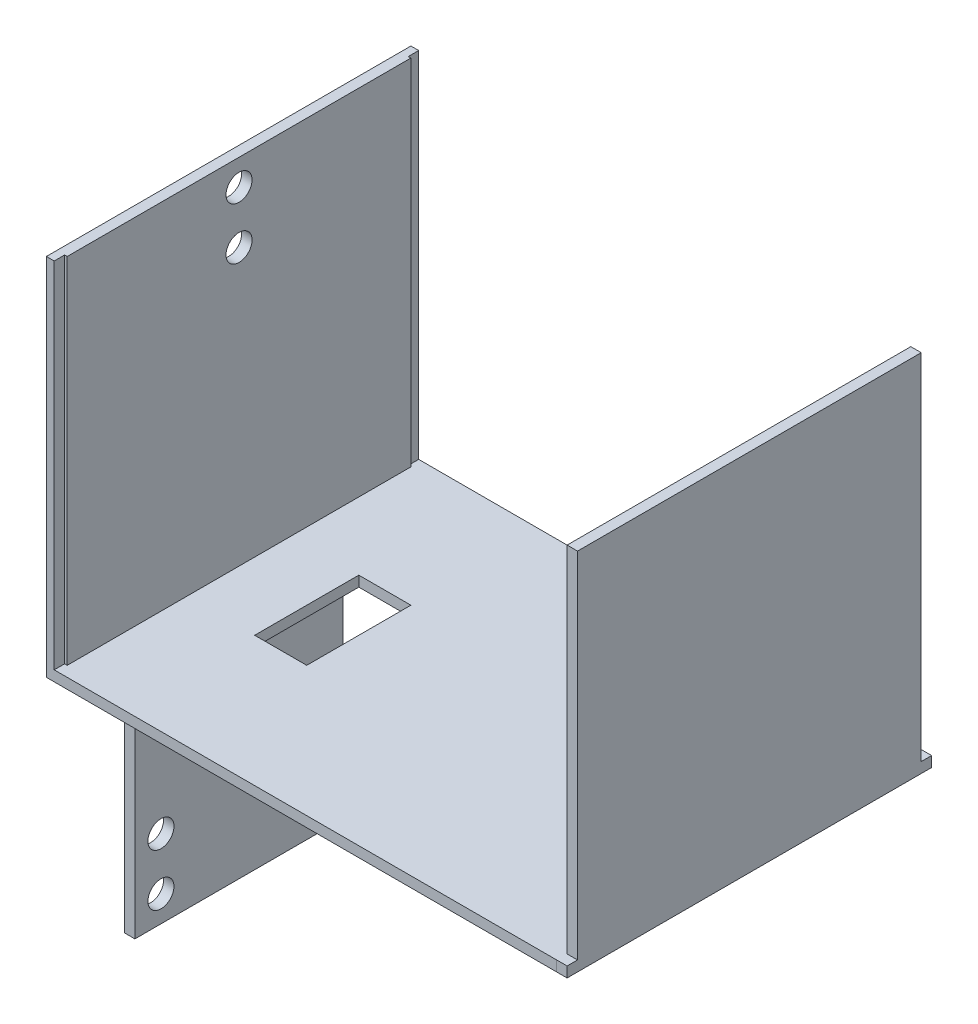
ISO-10303-21;
HEADER;
FILE_DESCRIPTION(('STEP AP214'),'2;1');
FILE_NAME('part.step','',(''),(''),'','','');
FILE_SCHEMA(('AUTOMOTIVE_DESIGN { 1 0 10303 214 1 1 1 1 }'));
ENDSEC;
DATA;
#1=APPLICATION_CONTEXT('core data for automotive mechanical design processes');
#2=APPLICATION_PROTOCOL_DEFINITION('international standard','automotive_design',2000,#1);
#3=PRODUCT_CONTEXT('',#1,'mechanical');
#4=PRODUCT('Part','Part','',(#3));
#5=PRODUCT_RELATED_PRODUCT_CATEGORY('part','',(#4));
#6=PRODUCT_DEFINITION_FORMATION('','',#4);
#7=PRODUCT_DEFINITION_CONTEXT('part definition',#1,'design');
#8=PRODUCT_DEFINITION('design','',#6,#7);
#9=PRODUCT_DEFINITION_SHAPE('','',#8);
#10=(LENGTH_UNIT() NAMED_UNIT(*) SI_UNIT(.MILLI.,.METRE.));
#11=(NAMED_UNIT(*) PLANE_ANGLE_UNIT() SI_UNIT($,.RADIAN.));
#12=(NAMED_UNIT(*) SI_UNIT($,.STERADIAN.) SOLID_ANGLE_UNIT());
#13=UNCERTAINTY_MEASURE_WITH_UNIT(LENGTH_MEASURE(1.E-05),#10,'distance_accuracy_value','');
#14=(GEOMETRIC_REPRESENTATION_CONTEXT(3) GLOBAL_UNCERTAINTY_ASSIGNED_CONTEXT((#13)) GLOBAL_UNIT_ASSIGNED_CONTEXT((#10,
#11,#12)) REPRESENTATION_CONTEXT('',''));
#15=CARTESIAN_POINT('',(0.,0.,0.));
#16=DIRECTION('',(0.,0.,1.));
#17=DIRECTION('',(1.,0.,0.));
#18=AXIS2_PLACEMENT_3D('',#15,#16,#17);
#19=CARTESIAN_POINT('',(0.,-10.8607855382087,70.));
#20=DIRECTION('',(0.,1.,0.));
#21=DIRECTION('',(0.,0.,1.));
#22=AXIS2_PLACEMENT_3D('',#19,#20,#21);
#23=PLANE('',#22);
#24=DIRECTION('',(-1.,0.,0.));
#25=VECTOR('',#24,1.);
#26=CARTESIAN_POINT('',(-23.1056124858747,-10.8607855382087,45.));
#27=LINE('',#26,#25);
#28=CARTESIAN_POINT('',(-23.1056124858747,-10.8607855382087,45.));
#29=VERTEX_POINT('',#28);
#30=CARTESIAN_POINT('',(-33.1056124858747,-10.8607855382087,45.));
#31=VERTEX_POINT('',#30);
#32=EDGE_CURVE('E350',#29,#31,#27,.T.);
#33=ORIENTED_EDGE('',*,*,#32,.F.);
#34=DIRECTION('',(0.,0.,1.));
#35=VECTOR('',#34,1.);
#36=CARTESIAN_POINT('',(-23.1056124858747,-10.8607855382087,25.));
#37=LINE('',#36,#35);
#38=CARTESIAN_POINT('',(-23.1056124858747,-10.8607855382087,25.));
#39=VERTEX_POINT('',#38);
#40=EDGE_CURVE('E353',#39,#29,#37,.T.);
#41=ORIENTED_EDGE('',*,*,#40,.F.);
#42=DIRECTION('',(1.,0.,0.));
#43=VECTOR('',#42,1.);
#44=CARTESIAN_POINT('',(-23.1056124858747,-10.8607855382087,25.));
#45=LINE('',#44,#43);
#46=CARTESIAN_POINT('',(-33.1056124858747,-10.8607855382087,25.));
#47=VERTEX_POINT('',#46);
#48=EDGE_CURVE('E340',#47,#39,#45,.T.);
#49=ORIENTED_EDGE('',*,*,#48,.F.);
#50=DIRECTION('',(0.,0.,-1.));
#51=VECTOR('',#50,1.);
#52=CARTESIAN_POINT('',(-33.1056124858747,-10.8607855382087,25.));
#53=LINE('',#52,#51);
#54=EDGE_CURVE('E347',#31,#47,#53,.T.);
#55=ORIENTED_EDGE('',*,*,#54,.F.);
#56=EDGE_LOOP('',(#33,#41,#49,#55));
#57=FACE_BOUND('',#56,.T.);
#58=DIRECTION('',(0.,0.,-1.));
#59=VECTOR('',#58,1.);
#60=CARTESIAN_POINT('',(49.8943875141253,-10.8607855382087,70.));
#61=LINE('',#60,#59);
#62=CARTESIAN_POINT('',(49.8943875141253,-10.8607855382087,70.));
#63=VERTEX_POINT('',#62);
#64=CARTESIAN_POINT('',(49.8943875141253,-10.8607855382087,0.));
#65=VERTEX_POINT('',#64);
#66=EDGE_CURVE('E11',#63,#65,#61,.T.);
#67=ORIENTED_EDGE('',*,*,#66,.F.);
#68=DIRECTION('',(1.,0.,0.));
#69=VECTOR('',#68,1.);
#70=CARTESIAN_POINT('',(0.,-10.8607855382087,70.));
#71=LINE('',#70,#69);
#72=CARTESIAN_POINT('',(-48.1056124858747,-10.8607855382087,70.));
#73=VERTEX_POINT('',#72);
#74=EDGE_CURVE('E246',#73,#63,#71,.T.);
#75=ORIENTED_EDGE('',*,*,#74,.F.);
#76=DIRECTION('',(0.,0.,-1.));
#77=VECTOR('',#76,1.);
#78=CARTESIAN_POINT('',(-48.1056124858747,-10.8607855382087,70.));
#79=LINE('',#78,#77);
#80=CARTESIAN_POINT('',(-48.1056124858747,-10.8607855382087,55.));
#81=VERTEX_POINT('',#80);
#82=EDGE_CURVE('E247',#73,#81,#79,.T.);
#83=ORIENTED_EDGE('',*,*,#82,.T.);
#84=DIRECTION('',(1.,0.,0.));
#85=VECTOR('',#84,1.);
#86=CARTESIAN_POINT('',(-48.1056124858747,-10.8607855382087,55.));
#87=LINE('',#86,#85);
#88=CARTESIAN_POINT('',(-46.1056124858747,-10.8607855382087,55.));
#89=VERTEX_POINT('',#88);
#90=EDGE_CURVE('E368',#81,#89,#87,.T.);
#91=ORIENTED_EDGE('',*,*,#90,.T.);
#92=DIRECTION('',(0.,0.,1.));
#93=VECTOR('',#92,1.);
#94=CARTESIAN_POINT('',(-46.1056124858747,-10.8607855382087,15.));
#95=LINE('',#94,#93);
#96=CARTESIAN_POINT('',(-46.1056124858747,-10.8607855382087,15.));
#97=VERTEX_POINT('',#96);
#98=EDGE_CURVE('E371',#97,#89,#95,.T.);
#99=ORIENTED_EDGE('',*,*,#98,.F.);
#100=DIRECTION('',(1.,0.,0.));
#101=VECTOR('',#100,1.);
#102=CARTESIAN_POINT('',(-48.1056124858747,-10.8607855382087,15.));
#103=LINE('',#102,#101);
#104=CARTESIAN_POINT('',(-48.1056124858747,-10.8607855382087,15.));
#105=VERTEX_POINT('',#104);
#106=EDGE_CURVE('E277',#105,#97,#103,.T.);
#107=ORIENTED_EDGE('',*,*,#106,.F.);
#108=CARTESIAN_POINT('',(-48.1056124858747,-10.8607855382087,0.));
#109=VERTEX_POINT('',#108);
#110=EDGE_CURVE('E245',#105,#109,#79,.T.);
#111=ORIENTED_EDGE('',*,*,#110,.T.);
#112=DIRECTION('',(1.,0.,0.));
#113=VECTOR('',#112,1.);
#114=CARTESIAN_POINT('',(0.,-10.8607855382087,0.));
#115=LINE('',#114,#113);
#116=EDGE_CURVE('E239',#109,#65,#115,.T.);
#117=ORIENTED_EDGE('',*,*,#116,.T.);
#118=EDGE_LOOP('',(#67,#75,#83,#91,#99,#107,#111,#117));
#119=FACE_BOUND('',#118,.T.);
#120=ADVANCED_FACE('F43',(#57,#119),#23,.F.);
#121=CARTESIAN_POINT('',(0.,0.,70.));
#122=DIRECTION('',(0.,0.,1.));
#123=DIRECTION('',(1.,0.,0.));
#124=AXIS2_PLACEMENT_3D('',#121,#122,#123);
#125=PLANE('',#124);
#126=DIRECTION('',(1.,0.,0.));
#127=VECTOR('',#126,1.);
#128=CARTESIAN_POINT('',(-46.6056124858747,-8.86078553820872,70.));
#129=LINE('',#128,#127);
#130=CARTESIAN_POINT('',(-46.6056124858747,-8.86078553820872,70.));
#131=VERTEX_POINT('',#130);
#132=CARTESIAN_POINT('',(49.8943875141253,-8.86078553820872,70.));
#133=VERTEX_POINT('',#132);
#134=EDGE_CURVE('E297',#131,#133,#129,.T.);
#135=ORIENTED_EDGE('',*,*,#134,.F.);
#136=DIRECTION('',(0.,-1.,0.));
#137=VECTOR('',#136,1.);
#138=CARTESIAN_POINT('',(-46.6056124858747,59.1392144617913,70.));
#139=LINE('',#138,#137);
#140=CARTESIAN_POINT('',(-46.6056124858747,59.1392144617913,70.));
#141=VERTEX_POINT('',#140);
#142=EDGE_CURVE('E412',#141,#131,#139,.T.);
#143=ORIENTED_EDGE('',*,*,#142,.F.);
#144=DIRECTION('',(1.,0.,0.));
#145=VECTOR('',#144,1.);
#146=CARTESIAN_POINT('',(0.,59.1392144617913,70.));
#147=LINE('',#146,#145);
#148=CARTESIAN_POINT('',(-48.1056124858747,59.1392144617913,70.));
#149=VERTEX_POINT('',#148);
#150=EDGE_CURVE('E308',#149,#141,#147,.T.);
#151=ORIENTED_EDGE('',*,*,#150,.F.);
#152=DIRECTION('',(0.,-1.,0.));
#153=VECTOR('',#152,1.);
#154=CARTESIAN_POINT('',(-48.1056124858747,0.,70.));
#155=LINE('',#154,#153);
#156=EDGE_CURVE('E307',#149,#73,#155,.T.);
#157=ORIENTED_EDGE('',*,*,#156,.T.);
#158=ORIENTED_EDGE('',*,*,#74,.T.);
#159=DIRECTION('',(0.,1.,0.));
#160=VECTOR('',#159,1.);
#161=CARTESIAN_POINT('',(49.8943875141253,0.,70.));
#162=LINE('',#161,#160);
#163=EDGE_CURVE('E52',#63,#133,#162,.T.);
#164=ORIENTED_EDGE('',*,*,#163,.T.);
#165=EDGE_LOOP('',(#135,#143,#151,#157,#158,#164));
#166=FACE_BOUND('',#165,.T.);
#167=ADVANCED_FACE('F295',(#166),#125,.T.);
#168=CARTESIAN_POINT('',(0.,0.,0.));
#169=DIRECTION('',(0.,0.,1.));
#170=DIRECTION('',(1.,0.,0.));
#171=AXIS2_PLACEMENT_3D('',#168,#169,#170);
#172=PLANE('',#171);
#173=DIRECTION('',(0.,1.,0.));
#174=VECTOR('',#173,1.);
#175=CARTESIAN_POINT('',(-46.6056124858747,59.1392144617913,0.));
#176=LINE('',#175,#174);
#177=CARTESIAN_POINT('',(-46.6056124858747,-8.86078553820872,0.));
#178=VERTEX_POINT('',#177);
#179=CARTESIAN_POINT('',(-46.6056124858747,59.1392144617913,0.));
#180=VERTEX_POINT('',#179);
#181=EDGE_CURVE('E205',#178,#180,#176,.T.);
#182=ORIENTED_EDGE('',*,*,#181,.F.);
#183=DIRECTION('',(1.,0.,0.));
#184=VECTOR('',#183,1.);
#185=CARTESIAN_POINT('',(-46.6056124858747,-8.86078553820872,0.));
#186=LINE('',#185,#184);
#187=CARTESIAN_POINT('',(49.8943875141253,-8.86078553820872,0.));
#188=VERTEX_POINT('',#187);
#189=EDGE_CURVE('E398',#178,#188,#186,.T.);
#190=ORIENTED_EDGE('',*,*,#189,.T.);
#191=DIRECTION('',(0.,1.,0.));
#192=VECTOR('',#191,1.);
#193=CARTESIAN_POINT('',(49.8943875141253,0.,0.));
#194=LINE('',#193,#192);
#195=EDGE_CURVE('E263',#65,#188,#194,.T.);
#196=ORIENTED_EDGE('',*,*,#195,.F.);
#197=ORIENTED_EDGE('',*,*,#116,.F.);
#198=DIRECTION('',(0.,-1.,0.));
#199=VECTOR('',#198,1.);
#200=CARTESIAN_POINT('',(-48.1056124858747,0.,0.));
#201=LINE('',#200,#199);
#202=CARTESIAN_POINT('',(-48.1056124858747,59.1392144617913,0.));
#203=VERTEX_POINT('',#202);
#204=EDGE_CURVE('E230',#203,#109,#201,.T.);
#205=ORIENTED_EDGE('',*,*,#204,.F.);
#206=DIRECTION('',(1.,0.,0.));
#207=VECTOR('',#206,1.);
#208=CARTESIAN_POINT('',(0.,59.1392144617913,0.));
#209=LINE('',#208,#207);
#210=EDGE_CURVE('E221',#203,#180,#209,.T.);
#211=ORIENTED_EDGE('',*,*,#210,.T.);
#212=EDGE_LOOP('',(#182,#190,#196,#197,#205,#211));
#213=FACE_BOUND('',#212,.T.);
#214=ADVANCED_FACE('F227',(#213),#172,.F.);
#215=CARTESIAN_POINT('',(0.,59.1392144617913,70.));
#216=DIRECTION('',(0.,1.,0.));
#217=DIRECTION('',(0.,0.,1.));
#218=AXIS2_PLACEMENT_3D('',#215,#216,#217);
#219=PLANE('',#218);
#220=DIRECTION('',(1.,0.,0.));
#221=VECTOR('',#220,1.);
#222=CARTESIAN_POINT('',(-46.6056124858747,59.1392144617913,2.));
#223=LINE('',#222,#221);
#224=CARTESIAN_POINT('',(-46.6056124858747,59.1392144617913,2.));
#225=VERTEX_POINT('',#224);
#226=CARTESIAN_POINT('',(-46.1056124858747,59.1392144617913,2.));
#227=VERTEX_POINT('',#226);
#228=EDGE_CURVE('E223',#225,#227,#223,.T.);
#229=ORIENTED_EDGE('',*,*,#228,.F.);
#230=DIRECTION('',(0.,0.,1.));
#231=VECTOR('',#230,1.);
#232=CARTESIAN_POINT('',(-46.6056124858747,59.1392144617913,0.));
#233=LINE('',#232,#231);
#234=EDGE_CURVE('E209',#180,#225,#233,.T.);
#235=ORIENTED_EDGE('',*,*,#234,.F.);
#236=ORIENTED_EDGE('',*,*,#210,.F.);
#237=DIRECTION('',(0.,0.,-1.));
#238=VECTOR('',#237,1.);
#239=CARTESIAN_POINT('',(-48.1056124858747,59.1392144617913,70.));
#240=LINE('',#239,#238);
#241=EDGE_CURVE('E249',#149,#203,#240,.T.);
#242=ORIENTED_EDGE('',*,*,#241,.F.);
#243=ORIENTED_EDGE('',*,*,#150,.T.);
#244=DIRECTION('',(0.,0.,1.));
#245=VECTOR('',#244,1.);
#246=CARTESIAN_POINT('',(-46.6056124858747,59.1392144617913,70.));
#247=LINE('',#246,#245);
#248=CARTESIAN_POINT('',(-46.6056124858747,59.1392144617913,68.));
#249=VERTEX_POINT('',#248);
#250=EDGE_CURVE('E416',#249,#141,#247,.T.);
#251=ORIENTED_EDGE('',*,*,#250,.F.);
#252=DIRECTION('',(1.,0.,0.));
#253=VECTOR('',#252,1.);
#254=CARTESIAN_POINT('',(-46.6056124858747,59.1392144617913,68.));
#255=LINE('',#254,#253);
#256=CARTESIAN_POINT('',(-46.1056124858747,59.1392144617913,68.));
#257=VERTEX_POINT('',#256);
#258=EDGE_CURVE('E406',#249,#257,#255,.T.);
#259=ORIENTED_EDGE('',*,*,#258,.T.);
#260=DIRECTION('',(0.,0.,1.));
#261=VECTOR('',#260,1.);
#262=CARTESIAN_POINT('',(-46.1056124858747,59.1392144617913,68.));
#263=LINE('',#262,#261);
#264=EDGE_CURVE('E324',#227,#257,#263,.T.);
#265=ORIENTED_EDGE('',*,*,#264,.F.);
#266=EDGE_LOOP('',(#229,#235,#236,#242,#243,#251,#259,#265));
#267=FACE_BOUND('',#266,.T.);
#268=ADVANCED_FACE('F220',(#267),#219,.T.);
#269=CARTESIAN_POINT('',(51.8943875141253,-10.8607855382087,70.));
#270=VERTEX_POINT('',#269);
#271=EDGE_CURVE('E303',#63,#270,#71,.T.);
#272=ORIENTED_EDGE('',*,*,#271,.F.);
#273=ORIENTED_EDGE('',*,*,#66,.T.);
#274=CARTESIAN_POINT('',(51.8943875141253,-10.8607855382087,0.));
#275=VERTEX_POINT('',#274);
#276=EDGE_CURVE('E233',#65,#275,#115,.T.);
#277=ORIENTED_EDGE('',*,*,#276,.T.);
#278=DIRECTION('',(0.,0.,-1.));
#279=VECTOR('',#278,1.);
#280=CARTESIAN_POINT('',(51.8943875141253,-10.8607855382087,70.));
#281=LINE('',#280,#279);
#282=EDGE_CURVE('E242',#270,#275,#281,.T.);
#283=ORIENTED_EDGE('',*,*,#282,.F.);
#284=EDGE_LOOP('',(#272,#273,#277,#283));
#285=FACE_BOUND('',#284,.T.);
#286=ADVANCED_FACE('F306',(#285),#23,.F.);
#287=ORIENTED_EDGE('',*,*,#195,.T.);
#288=CARTESIAN_POINT('',(51.8943875141253,-8.86078553820872,0.));
#289=VERTEX_POINT('',#288);
#290=EDGE_CURVE('E431',#188,#289,#186,.T.);
#291=ORIENTED_EDGE('',*,*,#290,.T.);
#292=DIRECTION('',(0.,-1.,0.));
#293=VECTOR('',#292,1.);
#294=CARTESIAN_POINT('',(51.8943875141253,0.,0.));
#295=LINE('',#294,#293);
#296=EDGE_CURVE('E231',#289,#275,#295,.T.);
#297=ORIENTED_EDGE('',*,*,#296,.T.);
#298=ORIENTED_EDGE('',*,*,#276,.F.);
#299=EDGE_LOOP('',(#287,#291,#297,#298));
#300=FACE_BOUND('',#299,.T.);
#301=ADVANCED_FACE('F444',(#300),#172,.F.);
#302=CARTESIAN_POINT('',(51.8943875141253,0.,70.));
#303=DIRECTION('',(1.,0.,0.));
#304=DIRECTION('',(0.,0.,-1.));
#305=AXIS2_PLACEMENT_3D('',#302,#303,#304);
#306=PLANE('',#305);
#307=DIRECTION('',(0.,0.,-1.));
#308=VECTOR('',#307,1.);
#309=CARTESIAN_POINT('',(51.8943875141253,-8.86078553820872,0.));
#310=LINE('',#309,#308);
#311=CARTESIAN_POINT('',(51.8943875141253,-8.86078553820872,2.));
#312=VERTEX_POINT('',#311);
#313=EDGE_CURVE('E216',#312,#289,#310,.T.);
#314=ORIENTED_EDGE('',*,*,#313,.F.);
#315=DIRECTION('',(0.,-1.,0.));
#316=VECTOR('',#315,1.);
#317=CARTESIAN_POINT('',(51.8943875141253,59.1392144617913,2.));
#318=LINE('',#317,#316);
#319=CARTESIAN_POINT('',(51.8943875141253,59.1392144617913,2.));
#320=VERTEX_POINT('',#319);
#321=EDGE_CURVE('E409',#320,#312,#318,.T.);
#322=ORIENTED_EDGE('',*,*,#321,.F.);
#323=DIRECTION('',(0.,0.,-1.));
#324=VECTOR('',#323,1.);
#325=CARTESIAN_POINT('',(51.8943875141253,59.1392144617913,70.));
#326=LINE('',#325,#324);
#327=CARTESIAN_POINT('',(51.8943875141253,59.1392144617913,68.));
#328=VERTEX_POINT('',#327);
#329=EDGE_CURVE('E251',#328,#320,#326,.T.);
#330=ORIENTED_EDGE('',*,*,#329,.F.);
#331=DIRECTION('',(0.,1.,0.));
#332=VECTOR('',#331,1.);
#333=CARTESIAN_POINT('',(51.8943875141253,59.1392144617913,68.));
#334=LINE('',#333,#332);
#335=CARTESIAN_POINT('',(51.8943875141253,-8.86078553820872,68.));
#336=VERTEX_POINT('',#335);
#337=EDGE_CURVE('E410',#336,#328,#334,.T.);
#338=ORIENTED_EDGE('',*,*,#337,.F.);
#339=DIRECTION('',(0.,0.,-1.));
#340=VECTOR('',#339,1.);
#341=CARTESIAN_POINT('',(51.8943875141253,-8.86078553820872,70.));
#342=LINE('',#341,#340);
#343=CARTESIAN_POINT('',(51.8943875141253,-8.86078553820872,70.));
#344=VERTEX_POINT('',#343);
#345=EDGE_CURVE('E413',#344,#336,#342,.T.);
#346=ORIENTED_EDGE('',*,*,#345,.F.);
#347=DIRECTION('',(0.,-1.,0.));
#348=VECTOR('',#347,1.);
#349=CARTESIAN_POINT('',(51.8943875141253,0.,70.));
#350=LINE('',#349,#348);
#351=EDGE_CURVE('E241',#344,#270,#350,.T.);
#352=ORIENTED_EDGE('',*,*,#351,.T.);
#353=ORIENTED_EDGE('',*,*,#282,.T.);
#354=ORIENTED_EDGE('',*,*,#296,.F.);
#355=EDGE_LOOP('',(#314,#322,#330,#338,#346,#352,#353,#354));
#356=FACE_BOUND('',#355,.T.);
#357=ADVANCED_FACE('F45',(#356),#306,.T.);
#358=CARTESIAN_POINT('',(49.8943875141253,59.1392144617913,2.));
#359=VERTEX_POINT('',#358);
#360=EDGE_CURVE('E428',#359,#320,#223,.T.);
#361=ORIENTED_EDGE('',*,*,#360,.F.);
#362=DIRECTION('',(0.,0.,-1.));
#363=VECTOR('',#362,1.);
#364=CARTESIAN_POINT('',(49.8943875141253,59.1392144617913,68.));
#365=LINE('',#364,#363);
#366=CARTESIAN_POINT('',(49.8943875141253,59.1392144617913,68.));
#367=VERTEX_POINT('',#366);
#368=EDGE_CURVE('E328',#367,#359,#365,.T.);
#369=ORIENTED_EDGE('',*,*,#368,.F.);
#370=EDGE_CURVE('E405',#367,#328,#255,.T.);
#371=ORIENTED_EDGE('',*,*,#370,.T.);
#372=ORIENTED_EDGE('',*,*,#329,.T.);
#373=EDGE_LOOP('',(#361,#369,#371,#372));
#374=FACE_BOUND('',#373,.T.);
#375=ADVANCED_FACE('F488',(#374),#219,.T.);
#376=CARTESIAN_POINT('',(-48.1056124858747,0.,70.));
#377=DIRECTION('',(1.,0.,0.));
#378=DIRECTION('',(0.,0.,-1.));
#379=AXIS2_PLACEMENT_3D('',#376,#377,#378);
#380=PLANE('',#379);
#381=CARTESIAN_POINT('',(-48.1056124858747,54.1392144617913,35.));
#382=DIRECTION('',(-1.,0.,0.));
#383=DIRECTION('',(0.,0.,1.));
#384=AXIS2_PLACEMENT_3D('',#381,#382,#383);
#385=CIRCLE('',#384,2.5);
#386=CARTESIAN_POINT('',(-48.1056124858747,54.1392144617913,37.5));
#387=VERTEX_POINT('',#386);
#388=EDGE_CURVE('E282',#387,#387,#385,.T.);
#389=ORIENTED_EDGE('',*,*,#388,.F.);
#390=EDGE_LOOP('',(#389));
#391=FACE_BOUND('',#390,.T.);
#392=CARTESIAN_POINT('',(-48.1056124858747,44.1392144617913,35.));
#393=DIRECTION('',(-1.,0.,0.));
#394=DIRECTION('',(0.,0.,1.));
#395=AXIS2_PLACEMENT_3D('',#392,#393,#394);
#396=CIRCLE('',#395,2.5);
#397=CARTESIAN_POINT('',(-48.1056124858747,44.1392144617913,37.5));
#398=VERTEX_POINT('',#397);
#399=EDGE_CURVE('E395',#398,#398,#396,.T.);
#400=ORIENTED_EDGE('',*,*,#399,.F.);
#401=EDGE_LOOP('',(#400));
#402=FACE_BOUND('',#401,.T.);
#403=CARTESIAN_POINT('',(-48.1056124858747,-45.8607855382087,20.));
#404=DIRECTION('',(-1.,0.,0.));
#405=DIRECTION('',(0.,0.,1.));
#406=AXIS2_PLACEMENT_3D('',#403,#404,#405);
#407=CIRCLE('',#406,2.5);
#408=CARTESIAN_POINT('',(-48.1056124858747,-45.8607855382087,22.5));
#409=VERTEX_POINT('',#408);
#410=EDGE_CURVE('E387',#409,#409,#407,.T.);
#411=ORIENTED_EDGE('',*,*,#410,.F.);
#412=EDGE_LOOP('',(#411));
#413=FACE_BOUND('',#412,.T.);
#414=CARTESIAN_POINT('',(-48.1056124858747,-55.8607855382087,50.));
#415=DIRECTION('',(-1.,0.,0.));
#416=DIRECTION('',(0.,0.,-1.));
#417=AXIS2_PLACEMENT_3D('',#414,#415,#416);
#418=CIRCLE('',#417,2.5);
#419=CARTESIAN_POINT('',(-48.1056124858747,-55.8607855382087,47.5));
#420=VERTEX_POINT('',#419);
#421=EDGE_CURVE('E388',#420,#420,#418,.T.);
#422=ORIENTED_EDGE('',*,*,#421,.F.);
#423=EDGE_LOOP('',(#422));
#424=FACE_BOUND('',#423,.T.);
#425=CARTESIAN_POINT('',(-48.1056124858747,-45.8607855382087,50.));
#426=DIRECTION('',(-1.,0.,0.));
#427=DIRECTION('',(0.,0.,-1.));
#428=AXIS2_PLACEMENT_3D('',#425,#426,#427);
#429=CIRCLE('',#428,2.5);
#430=CARTESIAN_POINT('',(-48.1056124858747,-45.8607855382087,47.5));
#431=VERTEX_POINT('',#430);
#432=EDGE_CURVE('E285',#431,#431,#429,.T.);
#433=ORIENTED_EDGE('',*,*,#432,.F.);
#434=EDGE_LOOP('',(#433));
#435=FACE_BOUND('',#434,.T.);
#436=CARTESIAN_POINT('',(-48.1056124858747,-55.8607855382087,20.));
#437=DIRECTION('',(-1.,0.,0.));
#438=DIRECTION('',(0.,0.,1.));
#439=AXIS2_PLACEMENT_3D('',#436,#437,#438);
#440=CIRCLE('',#439,2.5);
#441=CARTESIAN_POINT('',(-48.1056124858747,-55.8607855382087,22.5));
#442=VERTEX_POINT('',#441);
#443=EDGE_CURVE('E268',#442,#442,#440,.T.);
#444=ORIENTED_EDGE('',*,*,#443,.F.);
#445=EDGE_LOOP('',(#444));
#446=FACE_BOUND('',#445,.T.);
#447=ORIENTED_EDGE('',*,*,#204,.T.);
#448=ORIENTED_EDGE('',*,*,#110,.F.);
#449=DIRECTION('',(0.,1.,0.));
#450=VECTOR('',#449,1.);
#451=CARTESIAN_POINT('',(-48.1056124858747,-60.8607855382087,15.));
#452=LINE('',#451,#450);
#453=CARTESIAN_POINT('',(-48.1056124858747,-60.8607855382087,15.));
#454=VERTEX_POINT('',#453);
#455=EDGE_CURVE('E364',#454,#105,#452,.T.);
#456=ORIENTED_EDGE('',*,*,#455,.F.);
#457=DIRECTION('',(0.,0.,1.));
#458=VECTOR('',#457,1.);
#459=CARTESIAN_POINT('',(-48.1056124858747,-60.8607855382087,15.));
#460=LINE('',#459,#458);
#461=CARTESIAN_POINT('',(-48.1056124858747,-60.8607855382087,55.));
#462=VERTEX_POINT('',#461);
#463=EDGE_CURVE('E367',#454,#462,#460,.T.);
#464=ORIENTED_EDGE('',*,*,#463,.T.);
#465=DIRECTION('',(0.,1.,0.));
#466=VECTOR('',#465,1.);
#467=CARTESIAN_POINT('',(-48.1056124858747,-60.8607855382087,55.));
#468=LINE('',#467,#466);
#469=EDGE_CURVE('E361',#462,#81,#468,.T.);
#470=ORIENTED_EDGE('',*,*,#469,.T.);
#471=ORIENTED_EDGE('',*,*,#82,.F.);
#472=ORIENTED_EDGE('',*,*,#156,.F.);
#473=ORIENTED_EDGE('',*,*,#241,.T.);
#474=EDGE_LOOP('',(#447,#448,#456,#464,#470,#471,#472,#473));
#475=FACE_BOUND('',#474,.T.);
#476=ADVANCED_FACE('F448',(#391,#402,#413,#424,#435,#446,#475),#380,.F.);
#477=EDGE_CURVE('E305',#133,#344,#129,.T.);
#478=ORIENTED_EDGE('',*,*,#477,.F.);
#479=ORIENTED_EDGE('',*,*,#163,.F.);
#480=ORIENTED_EDGE('',*,*,#271,.T.);
#481=ORIENTED_EDGE('',*,*,#351,.F.);
#482=EDGE_LOOP('',(#478,#479,#480,#481));
#483=FACE_BOUND('',#482,.T.);
#484=ADVANCED_FACE('F301',(#483),#125,.T.);
#485=CARTESIAN_POINT('',(49.8943875141253,-8.86078553820872,68.));
#486=DIRECTION('',(1.,0.,0.));
#487=DIRECTION('',(0.,0.,-1.));
#488=AXIS2_PLACEMENT_3D('',#485,#486,#487);
#489=PLANE('',#488);
#490=ORIENTED_EDGE('',*,*,#368,.T.);
#491=DIRECTION('',(0.,1.,0.));
#492=VECTOR('',#491,1.);
#493=CARTESIAN_POINT('',(49.8943875141253,-8.86078553820872,2.));
#494=LINE('',#493,#492);
#495=CARTESIAN_POINT('',(49.8943875141253,-8.86078553820872,2.));
#496=VERTEX_POINT('',#495);
#497=EDGE_CURVE('E314',#496,#359,#494,.T.);
#498=ORIENTED_EDGE('',*,*,#497,.F.);
#499=DIRECTION('',(0.,0.,-1.));
#500=VECTOR('',#499,1.);
#501=CARTESIAN_POINT('',(49.8943875141253,-8.86078553820872,68.));
#502=LINE('',#501,#500);
#503=CARTESIAN_POINT('',(49.8943875141253,-8.86078553820872,68.));
#504=VERTEX_POINT('',#503);
#505=EDGE_CURVE('E327',#504,#496,#502,.T.);
#506=ORIENTED_EDGE('',*,*,#505,.F.);
#507=DIRECTION('',(0.,1.,0.));
#508=VECTOR('',#507,1.);
#509=CARTESIAN_POINT('',(49.8943875141253,-8.86078553820872,68.));
#510=LINE('',#509,#508);
#511=EDGE_CURVE('E235',#504,#367,#510,.T.);
#512=ORIENTED_EDGE('',*,*,#511,.T.);
#513=EDGE_LOOP('',(#490,#498,#506,#512));
#514=FACE_BOUND('',#513,.T.);
#515=ADVANCED_FACE('F507',(#514),#489,.F.);
#516=CARTESIAN_POINT('',(-46.1056124858747,-8.86078553820872,68.));
#517=DIRECTION('',(-1.,0.,0.));
#518=DIRECTION('',(0.,0.,1.));
#519=AXIS2_PLACEMENT_3D('',#516,#517,#518);
#520=PLANE('',#519);
#521=CARTESIAN_POINT('',(-46.1056124858747,54.1392144617913,35.));
#522=DIRECTION('',(-1.,0.,0.));
#523=DIRECTION('',(0.,0.,1.));
#524=AXIS2_PLACEMENT_3D('',#521,#522,#523);
#525=CIRCLE('',#524,2.5);
#526=CARTESIAN_POINT('',(-46.1056124858747,54.1392144617913,37.5));
#527=VERTEX_POINT('',#526);
#528=EDGE_CURVE('E281',#527,#527,#525,.T.);
#529=ORIENTED_EDGE('',*,*,#528,.T.);
#530=EDGE_LOOP('',(#529));
#531=FACE_BOUND('',#530,.T.);
#532=CARTESIAN_POINT('',(-46.1056124858747,44.1392144617913,35.));
#533=DIRECTION('',(-1.,0.,0.));
#534=DIRECTION('',(0.,0.,1.));
#535=AXIS2_PLACEMENT_3D('',#532,#533,#534);
#536=CIRCLE('',#535,2.5);
#537=CARTESIAN_POINT('',(-46.1056124858747,44.1392144617913,37.5));
#538=VERTEX_POINT('',#537);
#539=EDGE_CURVE('E278',#538,#538,#536,.T.);
#540=ORIENTED_EDGE('',*,*,#539,.T.);
#541=EDGE_LOOP('',(#540));
#542=FACE_BOUND('',#541,.T.);
#543=ORIENTED_EDGE('',*,*,#264,.T.);
#544=DIRECTION('',(0.,1.,0.));
#545=VECTOR('',#544,1.);
#546=CARTESIAN_POINT('',(-46.1056124858747,-8.86078553820872,68.));
#547=LINE('',#546,#545);
#548=CARTESIAN_POINT('',(-46.1056124858747,-8.86078553820872,68.));
#549=VERTEX_POINT('',#548);
#550=EDGE_CURVE('E320',#549,#257,#547,.T.);
#551=ORIENTED_EDGE('',*,*,#550,.F.);
#552=DIRECTION('',(0.,0.,1.));
#553=VECTOR('',#552,1.);
#554=CARTESIAN_POINT('',(-46.1056124858747,-8.86078553820872,68.));
#555=LINE('',#554,#553);
#556=CARTESIAN_POINT('',(-46.1056124858747,-8.86078553820872,2.00000000000001));
#557=VERTEX_POINT('',#556);
#558=EDGE_CURVE('E317',#557,#549,#555,.T.);
#559=ORIENTED_EDGE('',*,*,#558,.F.);
#560=DIRECTION('',(0.,1.,0.));
#561=VECTOR('',#560,1.);
#562=CARTESIAN_POINT('',(-46.1056124858747,-8.86078553820872,2.00000000000001));
#563=LINE('',#562,#561);
#564=EDGE_CURVE('E316',#557,#227,#563,.T.);
#565=ORIENTED_EDGE('',*,*,#564,.T.);
#566=EDGE_LOOP('',(#543,#551,#559,#565));
#567=FACE_BOUND('',#566,.T.);
#568=ADVANCED_FACE('F460',(#531,#542,#567),#520,.F.);
#569=CARTESIAN_POINT('',(0.,-8.86078553820872,0.));
#570=DIRECTION('',(0.,1.,0.));
#571=DIRECTION('',(0.,0.,1.));
#572=AXIS2_PLACEMENT_3D('',#569,#570,#571);
#573=PLANE('',#572);
#574=DIRECTION('',(0.,0.,-1.));
#575=VECTOR('',#574,1.);
#576=CARTESIAN_POINT('',(-23.1056124858747,-8.86078553820872,0.));
#577=LINE('',#576,#575);
#578=CARTESIAN_POINT('',(-23.1056124858747,-8.86078553820872,45.));
#579=VERTEX_POINT('',#578);
#580=CARTESIAN_POINT('',(-23.1056124858747,-8.86078553820872,25.));
#581=VERTEX_POINT('',#580);
#582=EDGE_CURVE('E261',#579,#581,#577,.T.);
#583=ORIENTED_EDGE('',*,*,#582,.F.);
#584=DIRECTION('',(1.,0.,0.));
#585=VECTOR('',#584,1.);
#586=CARTESIAN_POINT('',(0.,-8.86078553820872,45.));
#587=LINE('',#586,#585);
#588=CARTESIAN_POINT('',(-33.1056124858747,-8.86078553820872,45.));
#589=VERTEX_POINT('',#588);
#590=EDGE_CURVE('E254',#589,#579,#587,.T.);
#591=ORIENTED_EDGE('',*,*,#590,.F.);
#592=DIRECTION('',(0.,0.,1.));
#593=VECTOR('',#592,1.);
#594=CARTESIAN_POINT('',(-33.1056124858747,-8.86078553820872,0.));
#595=LINE('',#594,#593);
#596=CARTESIAN_POINT('',(-33.1056124858747,-8.86078553820872,25.));
#597=VERTEX_POINT('',#596);
#598=EDGE_CURVE('E256',#597,#589,#595,.T.);
#599=ORIENTED_EDGE('',*,*,#598,.F.);
#600=DIRECTION('',(-1.,0.,0.));
#601=VECTOR('',#600,1.);
#602=CARTESIAN_POINT('',(0.,-8.86078553820872,25.));
#603=LINE('',#602,#601);
#604=EDGE_CURVE('E259',#581,#597,#603,.T.);
#605=ORIENTED_EDGE('',*,*,#604,.F.);
#606=EDGE_LOOP('',(#583,#591,#599,#605));
#607=FACE_BOUND('',#606,.T.);
#608=ORIENTED_EDGE('',*,*,#505,.T.);
#609=DIRECTION('',(1.,0.,0.));
#610=VECTOR('',#609,1.);
#611=CARTESIAN_POINT('',(-46.6056124858747,-8.86078553820872,2.));
#612=LINE('',#611,#610);
#613=EDGE_CURVE('E427',#496,#312,#612,.T.);
#614=ORIENTED_EDGE('',*,*,#613,.T.);
#615=ORIENTED_EDGE('',*,*,#313,.T.);
#616=ORIENTED_EDGE('',*,*,#290,.F.);
#617=ORIENTED_EDGE('',*,*,#189,.F.);
#618=DIRECTION('',(0.,0.,-1.));
#619=VECTOR('',#618,1.);
#620=CARTESIAN_POINT('',(-46.6056124858747,-8.86078553820872,0.));
#621=LINE('',#620,#619);
#622=CARTESIAN_POINT('',(-46.6056124858747,-8.86078553820872,2.));
#623=VERTEX_POINT('',#622);
#624=EDGE_CURVE('E212',#623,#178,#621,.T.);
#625=ORIENTED_EDGE('',*,*,#624,.F.);
#626=EDGE_CURVE('E429',#623,#557,#612,.T.);
#627=ORIENTED_EDGE('',*,*,#626,.T.);
#628=ORIENTED_EDGE('',*,*,#558,.T.);
#629=DIRECTION('',(1.,0.,0.));
#630=VECTOR('',#629,1.);
#631=CARTESIAN_POINT('',(-46.6056124858747,-8.86078553820872,68.));
#632=LINE('',#631,#630);
#633=CARTESIAN_POINT('',(-46.6056124858747,-8.86078553820872,68.));
#634=VERTEX_POINT('',#633);
#635=EDGE_CURVE('E403',#634,#549,#632,.T.);
#636=ORIENTED_EDGE('',*,*,#635,.F.);
#637=DIRECTION('',(0.,0.,-1.));
#638=VECTOR('',#637,1.);
#639=CARTESIAN_POINT('',(-46.6056124858747,-8.86078553820872,70.));
#640=LINE('',#639,#638);
#641=EDGE_CURVE('E421',#131,#634,#640,.T.);
#642=ORIENTED_EDGE('',*,*,#641,.F.);
#643=ORIENTED_EDGE('',*,*,#134,.T.);
#644=ORIENTED_EDGE('',*,*,#477,.T.);
#645=ORIENTED_EDGE('',*,*,#345,.T.);
#646=EDGE_CURVE('E402',#504,#336,#632,.T.);
#647=ORIENTED_EDGE('',*,*,#646,.F.);
#648=EDGE_LOOP('',(#608,#614,#615,#616,#617,#625,#627,#628,#636,#642,#643,#644,#645,#647));
#649=FACE_BOUND('',#648,.T.);
#650=ADVANCED_FACE('F439',(#607,#649),#573,.T.);
#651=CARTESIAN_POINT('',(-23.1056124858747,-0.860785538208725,25.));
#652=DIRECTION('',(1.,0.,0.));
#653=DIRECTION('',(0.,0.,-1.));
#654=AXIS2_PLACEMENT_3D('',#651,#652,#653);
#655=PLANE('',#654);
#656=ORIENTED_EDGE('',*,*,#582,.T.);
#657=DIRECTION('',(0.,-1.,0.));
#658=VECTOR('',#657,1.);
#659=CARTESIAN_POINT('',(-23.1056124858747,-0.860785538208725,25.));
#660=LINE('',#659,#658);
#661=EDGE_CURVE('E331',#581,#39,#660,.T.);
#662=ORIENTED_EDGE('',*,*,#661,.T.);
#663=ORIENTED_EDGE('',*,*,#40,.T.);
#664=DIRECTION('',(0.,-1.,0.));
#665=VECTOR('',#664,1.);
#666=CARTESIAN_POINT('',(-23.1056124858747,-0.860785538208725,45.));
#667=LINE('',#666,#665);
#668=EDGE_CURVE('E336',#579,#29,#667,.T.);
#669=ORIENTED_EDGE('',*,*,#668,.F.);
#670=EDGE_LOOP('',(#656,#662,#663,#669));
#671=FACE_BOUND('',#670,.T.);
#672=ADVANCED_FACE('F566',(#671),#655,.F.);
#673=CARTESIAN_POINT('',(-23.1056124858747,-0.860785538208725,25.));
#674=DIRECTION('',(0.,0.,-1.));
#675=DIRECTION('',(-1.,0.,0.));
#676=AXIS2_PLACEMENT_3D('',#673,#674,#675);
#677=PLANE('',#676);
#678=ORIENTED_EDGE('',*,*,#604,.T.);
#679=DIRECTION('',(0.,-1.,0.));
#680=VECTOR('',#679,1.);
#681=CARTESIAN_POINT('',(-33.1056124858747,-0.860785538208725,25.));
#682=LINE('',#681,#680);
#683=EDGE_CURVE('E342',#597,#47,#682,.T.);
#684=ORIENTED_EDGE('',*,*,#683,.T.);
#685=ORIENTED_EDGE('',*,*,#48,.T.);
#686=ORIENTED_EDGE('',*,*,#661,.F.);
#687=EDGE_LOOP('',(#678,#684,#685,#686));
#688=FACE_BOUND('',#687,.T.);
#689=ADVANCED_FACE('F562',(#688),#677,.F.);
#690=CARTESIAN_POINT('',(-33.1056124858747,-0.860785538208725,25.));
#691=DIRECTION('',(-1.,0.,0.));
#692=DIRECTION('',(0.,0.,1.));
#693=AXIS2_PLACEMENT_3D('',#690,#691,#692);
#694=PLANE('',#693);
#695=ORIENTED_EDGE('',*,*,#598,.T.);
#696=DIRECTION('',(0.,-1.,0.));
#697=VECTOR('',#696,1.);
#698=CARTESIAN_POINT('',(-33.1056124858747,-0.860785538208725,45.));
#699=LINE('',#698,#697);
#700=EDGE_CURVE('E339',#589,#31,#699,.T.);
#701=ORIENTED_EDGE('',*,*,#700,.T.);
#702=ORIENTED_EDGE('',*,*,#54,.T.);
#703=ORIENTED_EDGE('',*,*,#683,.F.);
#704=EDGE_LOOP('',(#695,#701,#702,#703));
#705=FACE_BOUND('',#704,.T.);
#706=ADVANCED_FACE('F565',(#705),#694,.F.);
#707=CARTESIAN_POINT('',(-23.1056124858747,-0.860785538208725,45.));
#708=DIRECTION('',(0.,0.,1.));
#709=DIRECTION('',(1.,0.,0.));
#710=AXIS2_PLACEMENT_3D('',#707,#708,#709);
#711=PLANE('',#710);
#712=ORIENTED_EDGE('',*,*,#590,.T.);
#713=ORIENTED_EDGE('',*,*,#668,.T.);
#714=ORIENTED_EDGE('',*,*,#32,.T.);
#715=ORIENTED_EDGE('',*,*,#700,.F.);
#716=EDGE_LOOP('',(#712,#713,#714,#715));
#717=FACE_BOUND('',#716,.T.);
#718=ADVANCED_FACE('F560',(#717),#711,.F.);
#719=CARTESIAN_POINT('',(-48.1056124858747,-60.8607855382087,15.));
#720=DIRECTION('',(0.,0.,1.));
#721=DIRECTION('',(1.,0.,0.));
#722=AXIS2_PLACEMENT_3D('',#719,#720,#721);
#723=PLANE('',#722);
#724=ORIENTED_EDGE('',*,*,#106,.T.);
#725=DIRECTION('',(0.,1.,0.));
#726=VECTOR('',#725,1.);
#727=CARTESIAN_POINT('',(-46.1056124858747,-60.8607855382087,15.));
#728=LINE('',#727,#726);
#729=CARTESIAN_POINT('',(-46.1056124858747,-60.8607855382087,15.));
#730=VERTEX_POINT('',#729);
#731=EDGE_CURVE('E355',#730,#97,#728,.T.);
#732=ORIENTED_EDGE('',*,*,#731,.F.);
#733=DIRECTION('',(1.,0.,0.));
#734=VECTOR('',#733,1.);
#735=CARTESIAN_POINT('',(-48.1056124858747,-60.8607855382087,15.));
#736=LINE('',#735,#734);
#737=EDGE_CURVE('E370',#454,#730,#736,.T.);
#738=ORIENTED_EDGE('',*,*,#737,.F.);
#739=ORIENTED_EDGE('',*,*,#455,.T.);
#740=EDGE_LOOP('',(#724,#732,#738,#739));
#741=FACE_BOUND('',#740,.T.);
#742=ADVANCED_FACE('F556',(#741),#723,.F.);
#743=CARTESIAN_POINT('',(-46.1056124858747,-60.8607855382087,15.));
#744=DIRECTION('',(-1.,0.,0.));
#745=DIRECTION('',(0.,0.,1.));
#746=AXIS2_PLACEMENT_3D('',#743,#744,#745);
#747=PLANE('',#746);
#748=CARTESIAN_POINT('',(-46.1056124858747,-45.8607855382087,20.));
#749=DIRECTION('',(-1.,0.,0.));
#750=DIRECTION('',(0.,0.,1.));
#751=AXIS2_PLACEMENT_3D('',#748,#749,#750);
#752=CIRCLE('',#751,2.5);
#753=CARTESIAN_POINT('',(-46.1056124858747,-45.8607855382087,22.5));
#754=VERTEX_POINT('',#753);
#755=EDGE_CURVE('E274',#754,#754,#752,.T.);
#756=ORIENTED_EDGE('',*,*,#755,.T.);
#757=EDGE_LOOP('',(#756));
#758=FACE_BOUND('',#757,.T.);
#759=CARTESIAN_POINT('',(-46.1056124858747,-55.8607855382087,50.));
#760=DIRECTION('',(-1.,0.,0.));
#761=DIRECTION('',(0.,0.,1.));
#762=AXIS2_PLACEMENT_3D('',#759,#760,#761);
#763=CIRCLE('',#762,2.5);
#764=CARTESIAN_POINT('',(-46.1056124858747,-55.8607855382087,52.5));
#765=VERTEX_POINT('',#764);
#766=EDGE_CURVE('E271',#765,#765,#763,.T.);
#767=ORIENTED_EDGE('',*,*,#766,.T.);
#768=EDGE_LOOP('',(#767));
#769=FACE_BOUND('',#768,.T.);
#770=CARTESIAN_POINT('',(-46.1056124858747,-45.8607855382087,50.));
#771=DIRECTION('',(-1.,0.,0.));
#772=DIRECTION('',(0.,0.,1.));
#773=AXIS2_PLACEMENT_3D('',#770,#771,#772);
#774=CIRCLE('',#773,2.5);
#775=CARTESIAN_POINT('',(-46.1056124858747,-45.8607855382087,52.5));
#776=VERTEX_POINT('',#775);
#777=EDGE_CURVE('E267',#776,#776,#774,.T.);
#778=ORIENTED_EDGE('',*,*,#777,.T.);
#779=EDGE_LOOP('',(#778));
#780=FACE_BOUND('',#779,.T.);
#781=CARTESIAN_POINT('',(-46.1056124858747,-55.8607855382087,20.));
#782=DIRECTION('',(-1.,0.,0.));
#783=DIRECTION('',(0.,0.,1.));
#784=AXIS2_PLACEMENT_3D('',#781,#782,#783);
#785=CIRCLE('',#784,2.5);
#786=CARTESIAN_POINT('',(-46.1056124858747,-55.8607855382087,22.5));
#787=VERTEX_POINT('',#786);
#788=EDGE_CURVE('E264',#787,#787,#785,.T.);
#789=ORIENTED_EDGE('',*,*,#788,.T.);
#790=EDGE_LOOP('',(#789));
#791=FACE_BOUND('',#790,.T.);
#792=ORIENTED_EDGE('',*,*,#98,.T.);
#793=DIRECTION('',(0.,1.,0.));
#794=VECTOR('',#793,1.);
#795=CARTESIAN_POINT('',(-46.1056124858747,-60.8607855382087,55.));
#796=LINE('',#795,#794);
#797=CARTESIAN_POINT('',(-46.1056124858747,-60.8607855382087,55.));
#798=VERTEX_POINT('',#797);
#799=EDGE_CURVE('E358',#798,#89,#796,.T.);
#800=ORIENTED_EDGE('',*,*,#799,.F.);
#801=DIRECTION('',(0.,0.,1.));
#802=VECTOR('',#801,1.);
#803=CARTESIAN_POINT('',(-46.1056124858747,-60.8607855382087,15.));
#804=LINE('',#803,#802);
#805=EDGE_CURVE('E381',#730,#798,#804,.T.);
#806=ORIENTED_EDGE('',*,*,#805,.F.);
#807=ORIENTED_EDGE('',*,*,#731,.T.);
#808=EDGE_LOOP('',(#792,#800,#806,#807));
#809=FACE_BOUND('',#808,.T.);
#810=ADVANCED_FACE('F552',(#758,#769,#780,#791,#809),#747,.F.);
#811=CARTESIAN_POINT('',(-48.1056124858747,-60.8607855382087,55.));
#812=DIRECTION('',(0.,0.,1.));
#813=DIRECTION('',(1.,0.,0.));
#814=AXIS2_PLACEMENT_3D('',#811,#812,#813);
#815=PLANE('',#814);
#816=ORIENTED_EDGE('',*,*,#90,.F.);
#817=ORIENTED_EDGE('',*,*,#469,.F.);
#818=DIRECTION('',(1.,0.,0.));
#819=VECTOR('',#818,1.);
#820=CARTESIAN_POINT('',(-48.1056124858747,-60.8607855382087,55.));
#821=LINE('',#820,#819);
#822=EDGE_CURVE('E378',#462,#798,#821,.T.);
#823=ORIENTED_EDGE('',*,*,#822,.T.);
#824=ORIENTED_EDGE('',*,*,#799,.T.);
#825=EDGE_LOOP('',(#816,#817,#823,#824));
#826=FACE_BOUND('',#825,.T.);
#827=ADVANCED_FACE('F548',(#826),#815,.T.);
#828=CARTESIAN_POINT('',(0.,-60.8607855382087,0.));
#829=DIRECTION('',(0.,-1.,0.));
#830=DIRECTION('',(0.,0.,-1.));
#831=AXIS2_PLACEMENT_3D('',#828,#829,#830);
#832=PLANE('',#831);
#833=ORIENTED_EDGE('',*,*,#737,.T.);
#834=ORIENTED_EDGE('',*,*,#805,.T.);
#835=ORIENTED_EDGE('',*,*,#822,.F.);
#836=ORIENTED_EDGE('',*,*,#463,.F.);
#837=EDGE_LOOP('',(#833,#834,#835,#836));
#838=FACE_BOUND('',#837,.T.);
#839=ADVANCED_FACE('F544',(#838),#832,.T.);
#840=CARTESIAN_POINT('',(1.89438751412531,-55.8607855382087,20.));
#841=DIRECTION('',(-1.,0.,0.));
#842=DIRECTION('',(0.,0.,1.));
#843=AXIS2_PLACEMENT_3D('',#840,#841,#842);
#844=CYLINDRICAL_SURFACE('',#843,2.5);
#845=ORIENTED_EDGE('',*,*,#443,.T.);
#846=EDGE_LOOP('',(#845));
#847=FACE_BOUND('',#846,.T.);
#848=ORIENTED_EDGE('',*,*,#788,.F.);
#849=EDGE_LOOP('',(#848));
#850=FACE_BOUND('',#849,.T.);
#851=ADVANCED_FACE('F534',(#847,#850),#844,.F.);
#852=CARTESIAN_POINT('',(1.89438751412531,-45.8607855382087,50.));
#853=DIRECTION('',(-1.,0.,0.));
#854=DIRECTION('',(0.,0.,1.));
#855=AXIS2_PLACEMENT_3D('',#852,#853,#854);
#856=CYLINDRICAL_SURFACE('',#855,2.5);
#857=ORIENTED_EDGE('',*,*,#432,.T.);
#858=EDGE_LOOP('',(#857));
#859=FACE_BOUND('',#858,.T.);
#860=ORIENTED_EDGE('',*,*,#777,.F.);
#861=EDGE_LOOP('',(#860));
#862=FACE_BOUND('',#861,.T.);
#863=ADVANCED_FACE('F530',(#859,#862),#856,.F.);
#864=CARTESIAN_POINT('',(1.89438751412531,-55.8607855382087,50.));
#865=DIRECTION('',(-1.,0.,0.));
#866=DIRECTION('',(0.,0.,1.));
#867=AXIS2_PLACEMENT_3D('',#864,#865,#866);
#868=CYLINDRICAL_SURFACE('',#867,2.5);
#869=ORIENTED_EDGE('',*,*,#421,.T.);
#870=EDGE_LOOP('',(#869));
#871=FACE_BOUND('',#870,.T.);
#872=ORIENTED_EDGE('',*,*,#766,.F.);
#873=EDGE_LOOP('',(#872));
#874=FACE_BOUND('',#873,.T.);
#875=ADVANCED_FACE('F533',(#871,#874),#868,.F.);
#876=CARTESIAN_POINT('',(1.89438751412531,-45.8607855382087,20.));
#877=DIRECTION('',(-1.,0.,0.));
#878=DIRECTION('',(0.,0.,1.));
#879=AXIS2_PLACEMENT_3D('',#876,#877,#878);
#880=CYLINDRICAL_SURFACE('',#879,2.5);
#881=ORIENTED_EDGE('',*,*,#410,.T.);
#882=EDGE_LOOP('',(#881));
#883=FACE_BOUND('',#882,.T.);
#884=ORIENTED_EDGE('',*,*,#755,.F.);
#885=EDGE_LOOP('',(#884));
#886=FACE_BOUND('',#885,.T.);
#887=ADVANCED_FACE('F528',(#883,#886),#880,.F.);
#888=CARTESIAN_POINT('',(-43.1056124858747,44.1392144617913,35.));
#889=DIRECTION('',(-1.,0.,0.));
#890=DIRECTION('',(0.,0.,1.));
#891=AXIS2_PLACEMENT_3D('',#888,#889,#890);
#892=CYLINDRICAL_SURFACE('',#891,2.5);
#893=ORIENTED_EDGE('',*,*,#399,.T.);
#894=EDGE_LOOP('',(#893));
#895=FACE_BOUND('',#894,.T.);
#896=ORIENTED_EDGE('',*,*,#539,.F.);
#897=EDGE_LOOP('',(#896));
#898=FACE_BOUND('',#897,.T.);
#899=ADVANCED_FACE('F522',(#895,#898),#892,.F.);
#900=CARTESIAN_POINT('',(-43.1056124858747,54.1392144617913,35.));
#901=DIRECTION('',(-1.,0.,0.));
#902=DIRECTION('',(0.,0.,1.));
#903=AXIS2_PLACEMENT_3D('',#900,#901,#902);
#904=CYLINDRICAL_SURFACE('',#903,2.5);
#905=ORIENTED_EDGE('',*,*,#388,.T.);
#906=EDGE_LOOP('',(#905));
#907=FACE_BOUND('',#906,.T.);
#908=ORIENTED_EDGE('',*,*,#528,.F.);
#909=EDGE_LOOP('',(#908));
#910=FACE_BOUND('',#909,.T.);
#911=ADVANCED_FACE('F516',(#907,#910),#904,.F.);
#912=CARTESIAN_POINT('',(-46.6056124858747,59.1392144617913,68.));
#913=DIRECTION('',(0.,0.,-1.));
#914=DIRECTION('',(-1.,0.,0.));
#915=AXIS2_PLACEMENT_3D('',#912,#913,#914);
#916=PLANE('',#915);
#917=ORIENTED_EDGE('',*,*,#646,.T.);
#918=ORIENTED_EDGE('',*,*,#337,.T.);
#919=ORIENTED_EDGE('',*,*,#370,.F.);
#920=ORIENTED_EDGE('',*,*,#511,.F.);
#921=EDGE_LOOP('',(#917,#918,#919,#920));
#922=FACE_BOUND('',#921,.T.);
#923=ADVANCED_FACE('F511',(#922),#916,.F.);
#924=ORIENTED_EDGE('',*,*,#258,.F.);
#925=DIRECTION('',(0.,1.,0.));
#926=VECTOR('',#925,1.);
#927=CARTESIAN_POINT('',(-46.6056124858747,59.1392144617913,68.));
#928=LINE('',#927,#926);
#929=EDGE_CURVE('E418',#634,#249,#928,.T.);
#930=ORIENTED_EDGE('',*,*,#929,.F.);
#931=ORIENTED_EDGE('',*,*,#635,.T.);
#932=ORIENTED_EDGE('',*,*,#550,.T.);
#933=EDGE_LOOP('',(#924,#930,#931,#932));
#934=FACE_BOUND('',#933,.T.);
#935=ADVANCED_FACE('F457',(#934),#916,.F.);
#936=CARTESIAN_POINT('',(-46.6056124858747,0.,0.));
#937=DIRECTION('',(1.,0.,0.));
#938=DIRECTION('',(0.,0.,-1.));
#939=AXIS2_PLACEMENT_3D('',#936,#937,#938);
#940=PLANE('',#939);
#941=ORIENTED_EDGE('',*,*,#142,.T.);
#942=ORIENTED_EDGE('',*,*,#641,.T.);
#943=ORIENTED_EDGE('',*,*,#929,.T.);
#944=ORIENTED_EDGE('',*,*,#250,.T.);
#945=EDGE_LOOP('',(#941,#942,#943,#944));
#946=FACE_BOUND('',#945,.T.);
#947=ADVANCED_FACE('F454',(#946),#940,.T.);
#948=CARTESIAN_POINT('',(-46.6056124858747,59.1392144617913,2.));
#949=DIRECTION('',(0.,0.,1.));
#950=DIRECTION('',(1.,0.,0.));
#951=AXIS2_PLACEMENT_3D('',#948,#949,#950);
#952=PLANE('',#951);
#953=ORIENTED_EDGE('',*,*,#360,.T.);
#954=ORIENTED_EDGE('',*,*,#321,.T.);
#955=ORIENTED_EDGE('',*,*,#613,.F.);
#956=ORIENTED_EDGE('',*,*,#497,.T.);
#957=EDGE_LOOP('',(#953,#954,#955,#956));
#958=FACE_BOUND('',#957,.T.);
#959=ADVANCED_FACE('F464',(#958),#952,.F.);
#960=ORIENTED_EDGE('',*,*,#626,.F.);
#961=DIRECTION('',(0.,-1.,0.));
#962=VECTOR('',#961,1.);
#963=CARTESIAN_POINT('',(-46.6056124858747,59.1392144617913,2.));
#964=LINE('',#963,#962);
#965=EDGE_CURVE('E224',#225,#623,#964,.T.);
#966=ORIENTED_EDGE('',*,*,#965,.F.);
#967=ORIENTED_EDGE('',*,*,#228,.T.);
#968=ORIENTED_EDGE('',*,*,#564,.F.);
#969=EDGE_LOOP('',(#960,#966,#967,#968));
#970=FACE_BOUND('',#969,.T.);
#971=ADVANCED_FACE('F462',(#970),#952,.F.);
#972=CARTESIAN_POINT('',(-46.6056124858747,0.,0.));
#973=DIRECTION('',(-1.,0.,0.));
#974=DIRECTION('',(0.,0.,1.));
#975=AXIS2_PLACEMENT_3D('',#972,#973,#974);
#976=PLANE('',#975);
#977=ORIENTED_EDGE('',*,*,#181,.T.);
#978=ORIENTED_EDGE('',*,*,#234,.T.);
#979=ORIENTED_EDGE('',*,*,#965,.T.);
#980=ORIENTED_EDGE('',*,*,#624,.T.);
#981=EDGE_LOOP('',(#977,#978,#979,#980));
#982=FACE_BOUND('',#981,.T.);
#983=ADVANCED_FACE('F207',(#982),#976,.F.);
#984=CLOSED_SHELL('',(#120,#167,#214,#268,#286,#301,#357,#375,#476,#484,#515,#568,#650,#672,
#689,#706,#718,#742,#810,#827,#839,#851,#863,#875,#887,#899,#911,#923,#935,#947,#959,#971,#983));
#985=MANIFOLD_SOLID_BREP('B2',#984);
#986=ADVANCED_BREP_SHAPE_REPRESENTATION('',(#18,#985),#14);
#987=SHAPE_DEFINITION_REPRESENTATION(#9,#986);
ENDSEC;
END-ISO-10303-21;
